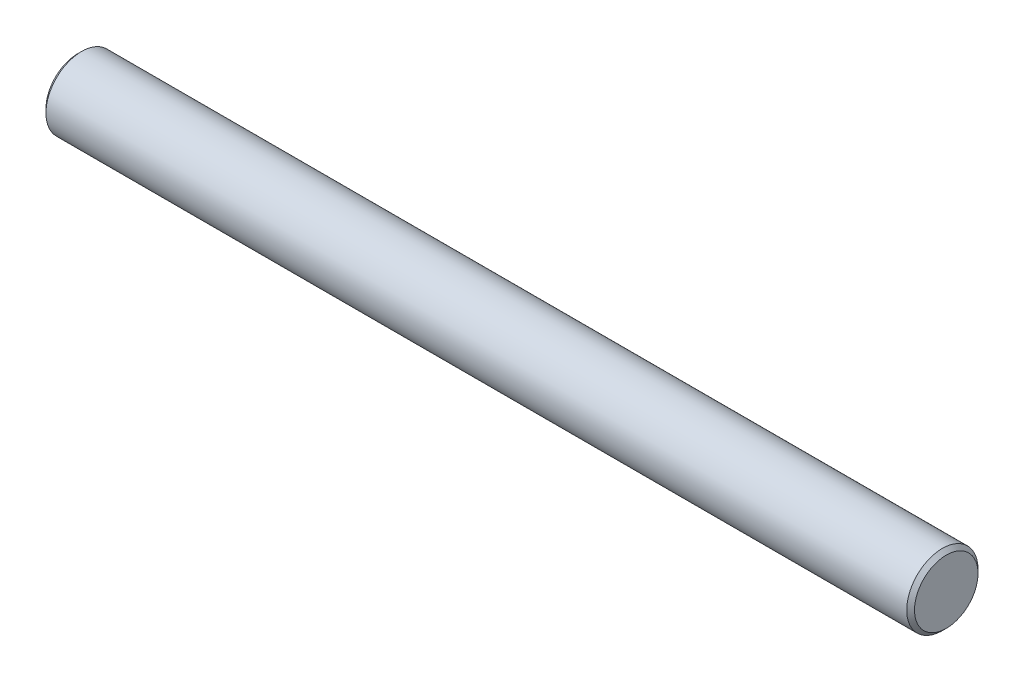
ISO-10303-21;
HEADER;
FILE_DESCRIPTION(('STEP AP214'),'2;1');
FILE_NAME('part.step','',(''),(''),'','','');
FILE_SCHEMA(('AUTOMOTIVE_DESIGN { 1 0 10303 214 1 1 1 1 }'));
ENDSEC;
DATA;
#1=APPLICATION_CONTEXT('core data for automotive mechanical design processes');
#2=APPLICATION_PROTOCOL_DEFINITION('international standard','automotive_design',2000,#1);
#3=PRODUCT_CONTEXT('',#1,'mechanical');
#4=PRODUCT('Part','Part','',(#3));
#5=PRODUCT_RELATED_PRODUCT_CATEGORY('part','',(#4));
#6=PRODUCT_DEFINITION_FORMATION('','',#4);
#7=PRODUCT_DEFINITION_CONTEXT('part definition',#1,'design');
#8=PRODUCT_DEFINITION('design','',#6,#7);
#9=PRODUCT_DEFINITION_SHAPE('','',#8);
#10=(LENGTH_UNIT() NAMED_UNIT(*) SI_UNIT(.MILLI.,.METRE.));
#11=(NAMED_UNIT(*) PLANE_ANGLE_UNIT() SI_UNIT($,.RADIAN.));
#12=(NAMED_UNIT(*) SI_UNIT($,.STERADIAN.) SOLID_ANGLE_UNIT());
#13=UNCERTAINTY_MEASURE_WITH_UNIT(LENGTH_MEASURE(1.E-05),#10,'distance_accuracy_value','');
#14=(GEOMETRIC_REPRESENTATION_CONTEXT(3) GLOBAL_UNCERTAINTY_ASSIGNED_CONTEXT((#13)) GLOBAL_UNIT_ASSIGNED_CONTEXT((#10,
#11,#12)) REPRESENTATION_CONTEXT('',''));
#15=CARTESIAN_POINT('',(0.,0.,0.));
#16=DIRECTION('',(0.,0.,1.));
#17=DIRECTION('',(1.,0.,0.));
#18=AXIS2_PLACEMENT_3D('',#15,#16,#17);
#19=CARTESIAN_POINT('',(-11.06556,0.,0.));
#20=DIRECTION('',(1.,0.,0.));
#21=DIRECTION('',(0.,0.,-1.));
#22=AXIS2_PLACEMENT_3D('',#19,#20,#21);
#23=CONICAL_SURFACE('',#22,0.916575000000001,0.785398163397458);
#24=CARTESIAN_POINT('',(-11.16555,0.,0.));
#25=DIRECTION('',(1.,0.,0.));
#26=DIRECTION('',(0.,0.,-1.));
#27=AXIS2_PLACEMENT_3D('',#24,#25,#26);
#28=CIRCLE('',#27,0.816584999999999);
#29=CARTESIAN_POINT('',(-11.16555,0.,-0.816584999999999));
#30=VERTEX_POINT('',#29);
#31=EDGE_CURVE('E47',#30,#30,#28,.T.);
#32=ORIENTED_EDGE('',*,*,#31,.T.);
#33=EDGE_LOOP('',(#32));
#34=FACE_BOUND('',#33,.T.);
#35=CARTESIAN_POINT('',(-11.06556,0.,0.));
#36=DIRECTION('',(1.,0.,0.));
#37=DIRECTION('',(0.,0.,-1.));
#38=AXIS2_PLACEMENT_3D('',#35,#36,#37);
#39=CIRCLE('',#38,0.916575000000001);
#40=CARTESIAN_POINT('',(-11.06556,0.,-0.916575000000001));
#41=VERTEX_POINT('',#40);
#42=EDGE_CURVE('E10',#41,#41,#39,.T.);
#43=ORIENTED_EDGE('',*,*,#42,.F.);
#44=EDGE_LOOP('',(#43));
#45=FACE_BOUND('',#44,.T.);
#46=ADVANCED_FACE('F33',(#34,#45),#23,.T.);
#47=CARTESIAN_POINT('',(-11.16555,0.,0.));
#48=DIRECTION('',(1.,0.,0.));
#49=DIRECTION('',(0.,0.,-1.));
#50=AXIS2_PLACEMENT_3D('',#47,#48,#49);
#51=CYLINDRICAL_SURFACE('',#50,0.916575);
#52=ORIENTED_EDGE('',*,*,#42,.T.);
#53=EDGE_LOOP('',(#52));
#54=FACE_BOUND('',#53,.T.);
#55=CARTESIAN_POINT('',(11.06556,0.,0.));
#56=DIRECTION('',(1.,0.,0.));
#57=DIRECTION('',(0.,0.,-1.));
#58=AXIS2_PLACEMENT_3D('',#55,#56,#57);
#59=CIRCLE('',#58,0.916575);
#60=CARTESIAN_POINT('',(11.06556,0.,-0.916575));
#61=VERTEX_POINT('',#60);
#62=EDGE_CURVE('E39',#61,#61,#59,.T.);
#63=ORIENTED_EDGE('',*,*,#62,.F.);
#64=EDGE_LOOP('',(#63));
#65=FACE_BOUND('',#64,.T.);
#66=ADVANCED_FACE('F66',(#54,#65),#51,.T.);
#67=CARTESIAN_POINT('',(11.16555,0.,0.));
#68=DIRECTION('',(-1.,0.,0.));
#69=DIRECTION('',(0.,0.,1.));
#70=AXIS2_PLACEMENT_3D('',#67,#68,#69);
#71=CONICAL_SURFACE('',#70,0.816585000000003,0.78539816339744);
#72=ORIENTED_EDGE('',*,*,#62,.T.);
#73=EDGE_LOOP('',(#72));
#74=FACE_BOUND('',#73,.T.);
#75=CARTESIAN_POINT('',(11.16555,0.,0.));
#76=DIRECTION('',(1.,0.,0.));
#77=DIRECTION('',(0.,0.,-1.));
#78=AXIS2_PLACEMENT_3D('',#75,#76,#77);
#79=CIRCLE('',#78,0.816585000000003);
#80=CARTESIAN_POINT('',(11.16555,0.,-0.816585000000003));
#81=VERTEX_POINT('',#80);
#82=EDGE_CURVE('E43',#81,#81,#79,.T.);
#83=ORIENTED_EDGE('',*,*,#82,.F.);
#84=EDGE_LOOP('',(#83));
#85=FACE_BOUND('',#84,.T.);
#86=ADVANCED_FACE('F62',(#74,#85),#71,.T.);
#87=CARTESIAN_POINT('',(11.16555,0.,0.));
#88=DIRECTION('',(1.,0.,0.));
#89=DIRECTION('',(0.,0.,-1.));
#90=AXIS2_PLACEMENT_3D('',#87,#88,#89);
#91=PLANE('',#90);
#92=ORIENTED_EDGE('',*,*,#82,.T.);
#93=EDGE_LOOP('',(#92));
#94=FACE_BOUND('',#93,.T.);
#95=ADVANCED_FACE('F57',(#94),#91,.T.);
#96=CARTESIAN_POINT('',(-11.16555,0.816584999999999,0.));
#97=DIRECTION('',(-1.,0.,0.));
#98=DIRECTION('',(0.,0.,1.));
#99=AXIS2_PLACEMENT_3D('',#96,#97,#98);
#100=PLANE('',#99);
#101=ORIENTED_EDGE('',*,*,#31,.F.);
#102=EDGE_LOOP('',(#101));
#103=FACE_BOUND('',#102,.T.);
#104=ADVANCED_FACE('F55',(#103),#100,.T.);
#105=CLOSED_SHELL('',(#46,#66,#86,#95,#104));
#106=MANIFOLD_SOLID_BREP('B2',#105);
#107=ADVANCED_BREP_SHAPE_REPRESENTATION('',(#18,#106),#14);
#108=SHAPE_DEFINITION_REPRESENTATION(#9,#107);
ENDSEC;
END-ISO-10303-21;
